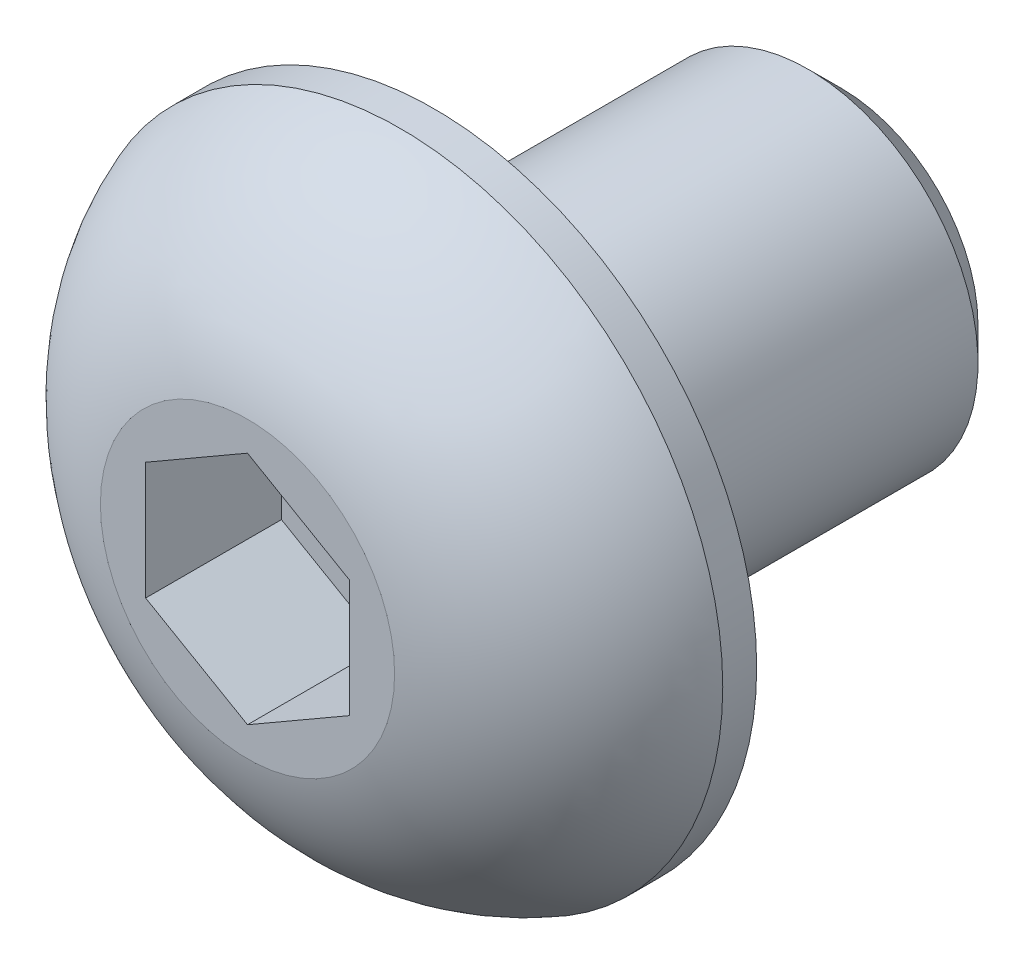
ISO-10303-21;
HEADER;
FILE_DESCRIPTION(('STEP AP214'),'2;1');
FILE_NAME('part.step','',(''),(''),'','','');
FILE_SCHEMA(('AUTOMOTIVE_DESIGN { 1 0 10303 214 1 1 1 1 }'));
ENDSEC;
DATA;
#1=APPLICATION_CONTEXT('core data for automotive mechanical design processes');
#2=APPLICATION_PROTOCOL_DEFINITION('international standard','automotive_design',2000,#1);
#3=PRODUCT_CONTEXT('',#1,'mechanical');
#4=PRODUCT('Part','Part','',(#3));
#5=PRODUCT_RELATED_PRODUCT_CATEGORY('part','',(#4));
#6=PRODUCT_DEFINITION_FORMATION('','',#4);
#7=PRODUCT_DEFINITION_CONTEXT('part definition',#1,'design');
#8=PRODUCT_DEFINITION('design','',#6,#7);
#9=PRODUCT_DEFINITION_SHAPE('','',#8);
#10=(LENGTH_UNIT() NAMED_UNIT(*) SI_UNIT(.MILLI.,.METRE.));
#11=(NAMED_UNIT(*) PLANE_ANGLE_UNIT() SI_UNIT($,.RADIAN.));
#12=(NAMED_UNIT(*) SI_UNIT($,.STERADIAN.) SOLID_ANGLE_UNIT());
#13=UNCERTAINTY_MEASURE_WITH_UNIT(LENGTH_MEASURE(1.E-05),#10,'distance_accuracy_value','');
#14=(GEOMETRIC_REPRESENTATION_CONTEXT(3) GLOBAL_UNCERTAINTY_ASSIGNED_CONTEXT((#13)) GLOBAL_UNIT_ASSIGNED_CONTEXT((#10,
#11,#12)) REPRESENTATION_CONTEXT('',''));
#15=CARTESIAN_POINT('',(0.,0.,0.));
#16=DIRECTION('',(0.,0.,1.));
#17=DIRECTION('',(1.,0.,0.));
#18=AXIS2_PLACEMENT_3D('',#15,#16,#17);
#19=CARTESIAN_POINT('',(0.,0.,0.24999999999209));
#20=DIRECTION('',(0.,0.,0.999999999999998));
#21=DIRECTION('',(-1.,0.,0.));
#22=AXIS2_PLACEMENT_3D('',#19,#20,#21);
#23=CYLINDRICAL_SURFACE('',#22,4.75000000004035);
#24=CARTESIAN_POINT('',(0.,0.,0.499999999985512));
#25=DIRECTION('',(0.,0.,-0.999999999999998));
#26=DIRECTION('',(-1.,0.,0.));
#27=AXIS2_PLACEMENT_3D('',#24,#25,#26);
#28=CIRCLE('',#27,4.75000000008071);
#29=CARTESIAN_POINT('',(-4.75000000008063,0.,0.499999999985401));
#30=VERTEX_POINT('',#29);
#31=EDGE_CURVE('E11',#30,#30,#28,.T.);
#32=ORIENTED_EDGE('',*,*,#31,.T.);
#33=EDGE_LOOP('',(#32));
#34=FACE_BOUND('',#33,.T.);
#35=CARTESIAN_POINT('',(0.,0.,0.));
#36=DIRECTION('',(0.,0.,-0.999999999999998));
#37=DIRECTION('',(-1.,0.,0.));
#38=AXIS2_PLACEMENT_3D('',#35,#36,#37);
#39=CIRCLE('',#38,4.75);
#40=CARTESIAN_POINT('',(-4.75000000000002,0.,0.));
#41=VERTEX_POINT('',#40);
#42=EDGE_CURVE('E125',#41,#41,#39,.T.);
#43=ORIENTED_EDGE('',*,*,#42,.F.);
#44=EDGE_LOOP('',(#43));
#45=FACE_BOUND('',#44,.T.);
#46=ADVANCED_FACE('F16',(#34,#45),#23,.T.);
#47=CARTESIAN_POINT('',(0.,0.,-0.710523895752546));
#48=DIRECTION('',(0.,0.,-0.999999999999998));
#49=DIRECTION('',(0.,-1.,0.));
#50=AXIS2_PLACEMENT_3D('',#47,#48,#49);
#51=DEGENERATE_TOROIDAL_SURFACE('',#50,1.42411293076997,3.53933509291781,.T.);
#52=CARTESIAN_POINT('',(0.,-1.11022302462516E-13,2.75000000000003));
#53=DIRECTION('',(0.,0.,-0.999999999999998));
#54=DIRECTION('',(-1.,0.,0.));
#55=AXIS2_PLACEMENT_3D('',#52,#53,#54);
#56=CIRCLE('',#55,2.166856);
#57=CARTESIAN_POINT('',(-2.16685600000012,0.,2.74999999999936));
#58=VERTEX_POINT('',#57);
#59=EDGE_CURVE('E27',#58,#58,#56,.T.);
#60=ORIENTED_EDGE('',*,*,#59,.T.);
#61=EDGE_LOOP('',(#60));
#62=FACE_BOUND('',#61,.T.);
#63=ORIENTED_EDGE('',*,*,#31,.F.);
#64=EDGE_LOOP('',(#63));
#65=FACE_BOUND('',#64,.T.);
#66=ADVANCED_FACE('F18',(#62,#65),#51,.T.);
#67=CARTESIAN_POINT('',(-1.94342799999969,1.11022302462516E-13,2.75000000000003));
#68=DIRECTION('',(0.,0.,0.999999999999998));
#69=DIRECTION('',(1.,0.,0.));
#70=AXIS2_PLACEMENT_3D('',#67,#68,#69);
#71=PLANE('',#70);
#72=ORIENTED_EDGE('',*,*,#59,.F.);
#73=EDGE_LOOP('',(#72));
#74=FACE_BOUND('',#73,.T.);
#75=DIRECTION('',(0.,-1.,0.));
#76=VECTOR('',#75,1.);
#77=CARTESIAN_POINT('',(1.50000000000003,0.216506350949941,2.74999999999936));
#78=LINE('',#77,#76);
#79=CARTESIAN_POINT('',(1.50000000000028,0.866025403799875,2.74999999999992));
#80=VERTEX_POINT('',#79);
#81=CARTESIAN_POINT('',(1.49999999999995,-0.866025403799986,2.75000000000014));
#82=VERTEX_POINT('',#81);
#83=EDGE_CURVE('E109',#80,#82,#78,.T.);
#84=ORIENTED_EDGE('',*,*,#83,.T.);
#85=DIRECTION('',(-0.866025403780548,-0.500000000006738,0.));
#86=VECTOR('',#85,1.);
#87=CARTESIAN_POINT('',(0.0212145000165753,-1.71980261030458,2.74999999999914));
#88=LINE('',#87,#86);
#89=CARTESIAN_POINT('',(1.11022302462516E-13,-1.73205080760008,2.7499999999987));
#90=VERTEX_POINT('',#89);
#91=EDGE_CURVE('E159',#82,#90,#88,.T.);
#92=ORIENTED_EDGE('',*,*,#91,.T.);
#93=DIRECTION('',(-0.866025403780548,0.500000000006738,0.));
#94=VECTOR('',#93,1.);
#95=CARTESIAN_POINT('',(-1.47878550000347,-0.87827360108389,2.74999999999948));
#96=LINE('',#95,#94);
#97=CARTESIAN_POINT('',(-1.49999999999996,-0.866025403799986,2.75000000000014));
#98=VERTEX_POINT('',#97);
#99=EDGE_CURVE('E20',#90,#98,#96,.T.);
#100=ORIENTED_EDGE('',*,*,#99,.T.);
#101=DIRECTION('',(0.,1.,0.));
#102=VECTOR('',#101,1.);
#103=CARTESIAN_POINT('',(-1.49999999999995,0.,2.74999999999948));
#104=LINE('',#103,#102);
#105=CARTESIAN_POINT('',(-1.49999999999996,0.866025403800097,2.74999999999992));
#106=VERTEX_POINT('',#105);
#107=EDGE_CURVE('E136',#98,#106,#104,.T.);
#108=ORIENTED_EDGE('',*,*,#107,.T.);
#109=DIRECTION('',(0.866025403780548,0.500000000006738,0.));
#110=VECTOR('',#109,1.);
#111=CARTESIAN_POINT('',(-1.47878550000324,0.878273601084001,2.75000000000003));
#112=LINE('',#111,#110);
#113=CARTESIAN_POINT('',(-1.11022302462516E-13,1.73205080759986,2.74999999999948));
#114=VERTEX_POINT('',#113);
#115=EDGE_CURVE('E50',#106,#114,#112,.T.);
#116=ORIENTED_EDGE('',*,*,#115,.T.);
#117=DIRECTION('',(0.866025403780548,-0.500000000006738,0.));
#118=VECTOR('',#117,1.);
#119=CARTESIAN_POINT('',(0.0212145000166863,1.71980261030447,2.74999999999948));
#120=LINE('',#119,#118);
#121=EDGE_CURVE('E101',#114,#80,#120,.T.);
#122=ORIENTED_EDGE('',*,*,#121,.T.);
#123=EDGE_LOOP('',(#84,#92,#100,#108,#116,#122));
#124=FACE_BOUND('',#123,.T.);
#125=ADVANCED_FACE('F206',(#74,#124),#71,.T.);
#126=CARTESIAN_POINT('',(-1.00462500000001,-1.66533453693773E-13,-6.00000000000056));
#127=DIRECTION('',(0.,0.,-0.999999999999998));
#128=DIRECTION('',(-1.,0.,0.));
#129=AXIS2_PLACEMENT_3D('',#126,#127,#128);
#130=PLANE('',#129);
#131=CARTESIAN_POINT('',(0.,-1.66533453693773E-13,-6.00000000000001));
#132=DIRECTION('',(0.,0.,-0.999999999999998));
#133=DIRECTION('',(-1.,0.,0.));
#134=AXIS2_PLACEMENT_3D('',#131,#132,#133);
#135=CIRCLE('',#134,2.00925);
#136=CARTESIAN_POINT('',(-2.00924999999996,0.,-6.00000000000067));
#137=VERTEX_POINT('',#136);
#138=EDGE_CURVE('E128',#137,#137,#135,.T.);
#139=ORIENTED_EDGE('',*,*,#138,.T.);
#140=EDGE_LOOP('',(#139));
#141=FACE_BOUND('',#140,.T.);
#142=ADVANCED_FACE('F215',(#141),#130,.T.);
#143=CARTESIAN_POINT('',(0.,0.,-5.75462500000057));
#144=DIRECTION('',(0.,0.,0.999999999999998));
#145=DIRECTION('',(-1.,0.,0.));
#146=AXIS2_PLACEMENT_3D('',#143,#144,#145);
#147=CONICAL_SURFACE('',#146,2.254625,0.785398163397448);
#148=CARTESIAN_POINT('',(0.,0.,-5.50925000000002));
#149=DIRECTION('',(0.,0.,-0.999999999999998));
#150=DIRECTION('',(-1.,0.,0.));
#151=AXIS2_PLACEMENT_3D('',#148,#149,#150);
#152=CIRCLE('',#151,2.5);
#153=CARTESIAN_POINT('',(-2.49999999999993,1.11022302462516E-13,-5.50925000000069));
#154=VERTEX_POINT('',#153);
#155=EDGE_CURVE('E124',#154,#154,#152,.T.);
#156=ORIENTED_EDGE('',*,*,#155,.T.);
#157=EDGE_LOOP('',(#156));
#158=FACE_BOUND('',#157,.T.);
#159=ORIENTED_EDGE('',*,*,#138,.F.);
#160=EDGE_LOOP('',(#159));
#161=FACE_BOUND('',#160,.T.);
#162=ADVANCED_FACE('F213',(#158,#161),#147,.T.);
#163=CARTESIAN_POINT('',(0.,0.,-2.85462500000011));
#164=DIRECTION('',(0.,0.,0.999999999999998));
#165=DIRECTION('',(-1.,0.,0.));
#166=AXIS2_PLACEMENT_3D('',#163,#164,#165);
#167=CYLINDRICAL_SURFACE('',#166,2.5);
#168=CARTESIAN_POINT('',(0.,0.,-0.200000000000644));
#169=DIRECTION('',(0.,0.,-0.999999999999998));
#170=DIRECTION('',(-1.,0.,0.));
#171=AXIS2_PLACEMENT_3D('',#168,#169,#170);
#172=CIRCLE('',#171,2.5);
#173=CARTESIAN_POINT('',(-2.49999999999995,1.11022302462516E-13,-0.2000000000002));
#174=VERTEX_POINT('',#173);
#175=EDGE_CURVE('E122',#174,#174,#172,.T.);
#176=ORIENTED_EDGE('',*,*,#175,.T.);
#177=EDGE_LOOP('',(#176));
#178=FACE_BOUND('',#177,.T.);
#179=ORIENTED_EDGE('',*,*,#155,.F.);
#180=EDGE_LOOP('',(#179));
#181=FACE_BOUND('',#180,.T.);
#182=ADVANCED_FACE('F197',(#178,#181),#167,.T.);
#183=CARTESIAN_POINT('',(0.,0.,-0.200000000000644));
#184=DIRECTION('',(0.,0.,-0.999999999999998));
#185=DIRECTION('',(0.,-1.,0.));
#186=AXIS2_PLACEMENT_3D('',#183,#184,#185);
#187=TOROIDAL_SURFACE('',#186,2.7,0.2);
#188=CARTESIAN_POINT('',(0.,0.,0.));
#189=DIRECTION('',(0.,0.,-0.999999999999998));
#190=DIRECTION('',(-1.,0.,0.));
#191=AXIS2_PLACEMENT_3D('',#188,#189,#190);
#192=CIRCLE('',#191,2.7);
#193=CARTESIAN_POINT('',(-2.69999999999994,-1.11022302462516E-13,-6.66133814775094E-13));
#194=VERTEX_POINT('',#193);
#195=EDGE_CURVE('E165',#194,#194,#192,.T.);
#196=ORIENTED_EDGE('',*,*,#195,.T.);
#197=EDGE_LOOP('',(#196));
#198=FACE_BOUND('',#197,.T.);
#199=ORIENTED_EDGE('',*,*,#175,.F.);
#200=EDGE_LOOP('',(#199));
#201=FACE_BOUND('',#200,.T.);
#202=ADVANCED_FACE('F182',(#198,#201),#187,.F.);
#203=CARTESIAN_POINT('',(-3.72499999999996,0.,0.));
#204=DIRECTION('',(0.,0.,-0.999999999999998));
#205=DIRECTION('',(-1.,0.,0.));
#206=AXIS2_PLACEMENT_3D('',#203,#204,#205);
#207=PLANE('',#206);
#208=ORIENTED_EDGE('',*,*,#42,.T.);
#209=EDGE_LOOP('',(#208));
#210=FACE_BOUND('',#209,.T.);
#211=ORIENTED_EDGE('',*,*,#195,.F.);
#212=EDGE_LOOP('',(#211));
#213=FACE_BOUND('',#212,.T.);
#214=ADVANCED_FACE('F186',(#210,#213),#207,.T.);
#215=CARTESIAN_POINT('',(3.33066907387547E-13,-1.11022302462516E-13,0.749999999999806));
#216=DIRECTION('',(0.,0.,-0.999999999999998));
#217=DIRECTION('',(1.,0.,0.));
#218=AXIS2_PLACEMENT_3D('',#215,#216,#217);
#219=PLANE('',#218);
#220=DIRECTION('',(0.,1.,0.));
#221=VECTOR('',#220,1.);
#222=CARTESIAN_POINT('',(1.50000000000029,0.,0.750000000000028));
#223=LINE('',#222,#221);
#224=CARTESIAN_POINT('',(1.50000000000008,-0.866025403799986,0.749999999999362));
#225=VERTEX_POINT('',#224);
#226=CARTESIAN_POINT('',(1.50000000000006,0.866025403800041,0.750000000000028));
#227=VERTEX_POINT('',#226);
#228=EDGE_CURVE('E107',#225,#227,#223,.T.);
#229=ORIENTED_EDGE('',*,*,#228,.T.);
#230=DIRECTION('',(-0.866025403780548,0.500000000006738,0.));
#231=VECTOR('',#230,1.);
#232=CARTESIAN_POINT('',(3.19189119579733E-13,1.73205080760003,0.750000000000028));
#233=LINE('',#232,#231);
#234=CARTESIAN_POINT('',(3.19189119579733E-13,1.73205080760003,0.750000000000028));
#235=VERTEX_POINT('',#234);
#236=EDGE_CURVE('E93',#227,#235,#233,.T.);
#237=ORIENTED_EDGE('',*,*,#236,.T.);
#238=DIRECTION('',(-0.866025403780548,-0.500000000006738,0.));
#239=VECTOR('',#238,1.);
#240=CARTESIAN_POINT('',(-1.50000000000017,0.866025403799986,0.749999999999251));
#241=LINE('',#240,#239);
#242=CARTESIAN_POINT('',(-1.50000000000017,0.866025403799986,0.749999999999251));
#243=VERTEX_POINT('',#242);
#244=EDGE_CURVE('E60',#235,#243,#241,.T.);
#245=ORIENTED_EDGE('',*,*,#244,.T.);
#246=DIRECTION('',(0.,-1.,0.));
#247=VECTOR('',#246,1.);
#248=CARTESIAN_POINT('',(-1.50000000000006,-0.866025403799986,0.750000000000028));
#249=LINE('',#248,#247);
#250=CARTESIAN_POINT('',(-1.50000000000006,-0.866025403799986,0.750000000000028));
#251=VERTEX_POINT('',#250);
#252=EDGE_CURVE('E133',#243,#251,#249,.T.);
#253=ORIENTED_EDGE('',*,*,#252,.T.);
#254=DIRECTION('',(0.866025403780548,-0.500000000006738,0.));
#255=VECTOR('',#254,1.);
#256=CARTESIAN_POINT('',(0.,-1.73205080760003,0.75000000000025));
#257=LINE('',#256,#255);
#258=CARTESIAN_POINT('',(0.,-1.73205080760003,0.75000000000025));
#259=VERTEX_POINT('',#258);
#260=EDGE_CURVE('E151',#251,#259,#257,.T.);
#261=ORIENTED_EDGE('',*,*,#260,.T.);
#262=DIRECTION('',(0.866025403780548,0.500000000006738,0.));
#263=VECTOR('',#262,1.);
#264=CARTESIAN_POINT('',(1.50000000000008,-0.866025403799986,0.749999999999362));
#265=LINE('',#264,#263);
#266=EDGE_CURVE('E87',#259,#225,#265,.T.);
#267=ORIENTED_EDGE('',*,*,#266,.T.);
#268=EDGE_LOOP('',(#229,#237,#245,#253,#261,#267));
#269=FACE_BOUND('',#268,.T.);
#270=ADVANCED_FACE('F112',(#269),#219,.F.);
#271=CARTESIAN_POINT('',(0.750000000000028,-1.29903810570009,2.75000000000059));
#272=DIRECTION('',(0.500000000006738,-0.866025403780548,0.));
#273=DIRECTION('',(-0.866025403780548,-0.500000000006738,0.));
#274=AXIS2_PLACEMENT_3D('',#271,#272,#273);
#275=PLANE('',#274);
#276=ORIENTED_EDGE('',*,*,#266,.F.);
#277=DIRECTION('',(0.,0.,-0.999999999999998));
#278=VECTOR('',#277,1.);
#279=CARTESIAN_POINT('',(1.11022302462516E-13,-1.73205080760008,2.7499999999987));
#280=LINE('',#279,#278);
#281=EDGE_CURVE('E154',#90,#259,#280,.T.);
#282=ORIENTED_EDGE('',*,*,#281,.F.);
#283=ORIENTED_EDGE('',*,*,#91,.F.);
#284=DIRECTION('',(0.,0.,-0.999999999999998));
#285=VECTOR('',#284,1.);
#286=CARTESIAN_POINT('',(1.49999999999995,-0.866025403799986,2.75000000000014));
#287=LINE('',#286,#285);
#288=EDGE_CURVE('E114',#82,#225,#287,.T.);
#289=ORIENTED_EDGE('',*,*,#288,.T.);
#290=EDGE_LOOP('',(#276,#282,#283,#289));
#291=FACE_BOUND('',#290,.T.);
#292=ADVANCED_FACE('F195',(#291),#275,.F.);
#293=CARTESIAN_POINT('',(-0.750000000000042,-1.29903810570003,2.74999999999936));
#294=DIRECTION('',(-0.500000000006738,-0.866025403780548,0.));
#295=DIRECTION('',(-0.866025403780548,0.500000000006738,0.));
#296=AXIS2_PLACEMENT_3D('',#293,#294,#295);
#297=PLANE('',#296);
#298=ORIENTED_EDGE('',*,*,#260,.F.);
#299=DIRECTION('',(0.,0.,-0.999999999999998));
#300=VECTOR('',#299,1.);
#301=CARTESIAN_POINT('',(-1.49999999999996,-0.866025403799986,2.75000000000014));
#302=LINE('',#301,#300);
#303=EDGE_CURVE('E141',#98,#251,#302,.T.);
#304=ORIENTED_EDGE('',*,*,#303,.F.);
#305=ORIENTED_EDGE('',*,*,#99,.F.);
#306=ORIENTED_EDGE('',*,*,#281,.T.);
#307=EDGE_LOOP('',(#298,#304,#305,#306));
#308=FACE_BOUND('',#307,.T.);
#309=ADVANCED_FACE('F263',(#308),#297,.F.);
#310=CARTESIAN_POINT('',(-1.49999999999995,0.,2.74999999999948));
#311=DIRECTION('',(-1.,0.,0.));
#312=DIRECTION('',(0.,1.,0.));
#313=AXIS2_PLACEMENT_3D('',#310,#311,#312);
#314=PLANE('',#313);
#315=ORIENTED_EDGE('',*,*,#252,.F.);
#316=DIRECTION('',(0.,0.,-0.999999999999998));
#317=VECTOR('',#316,1.);
#318=CARTESIAN_POINT('',(-1.49999999999996,0.866025403800097,2.74999999999992));
#319=LINE('',#318,#317);
#320=EDGE_CURVE('E137',#106,#243,#319,.T.);
#321=ORIENTED_EDGE('',*,*,#320,.F.);
#322=ORIENTED_EDGE('',*,*,#107,.F.);
#323=ORIENTED_EDGE('',*,*,#303,.T.);
#324=EDGE_LOOP('',(#315,#321,#322,#323));
#325=FACE_BOUND('',#324,.T.);
#326=ADVANCED_FACE('F223',(#325),#314,.F.);
#327=CARTESIAN_POINT('',(-0.749999999999806,1.29903810569998,2.74999999999936));
#328=DIRECTION('',(-0.500000000006738,0.866025403780548,0.));
#329=DIRECTION('',(0.866025403780548,0.500000000006738,0.));
#330=AXIS2_PLACEMENT_3D('',#327,#328,#329);
#331=PLANE('',#330);
#332=ORIENTED_EDGE('',*,*,#244,.F.);
#333=DIRECTION('',(0.,0.,-0.999999999999998));
#334=VECTOR('',#333,1.);
#335=CARTESIAN_POINT('',(-1.11022302462516E-13,1.73205080759986,2.74999999999948));
#336=LINE('',#335,#334);
#337=EDGE_CURVE('E99',#114,#235,#336,.T.);
#338=ORIENTED_EDGE('',*,*,#337,.F.);
#339=ORIENTED_EDGE('',*,*,#115,.F.);
#340=ORIENTED_EDGE('',*,*,#320,.T.);
#341=EDGE_LOOP('',(#332,#338,#339,#340));
#342=FACE_BOUND('',#341,.T.);
#343=ADVANCED_FACE('F221',(#342),#331,.F.);
#344=CARTESIAN_POINT('',(0.750000000000042,1.29903810569998,2.74999999999959));
#345=DIRECTION('',(0.500000000006738,0.866025403780548,0.));
#346=DIRECTION('',(0.866025403780548,-0.500000000006738,0.));
#347=AXIS2_PLACEMENT_3D('',#344,#345,#346);
#348=PLANE('',#347);
#349=ORIENTED_EDGE('',*,*,#236,.F.);
#350=DIRECTION('',(0.,0.,-0.999999999999998));
#351=VECTOR('',#350,1.);
#352=CARTESIAN_POINT('',(1.50000000000028,0.866025403799875,2.74999999999992));
#353=LINE('',#352,#351);
#354=EDGE_CURVE('E97',#80,#227,#353,.T.);
#355=ORIENTED_EDGE('',*,*,#354,.F.);
#356=ORIENTED_EDGE('',*,*,#121,.F.);
#357=ORIENTED_EDGE('',*,*,#337,.T.);
#358=EDGE_LOOP('',(#349,#355,#356,#357));
#359=FACE_BOUND('',#358,.T.);
#360=ADVANCED_FACE('F95',(#359),#348,.F.);
#361=CARTESIAN_POINT('',(1.50000000000029,0.433012701899993,2.75000000000003));
#362=DIRECTION('',(1.,0.,0.));
#363=DIRECTION('',(0.,-1.,0.));
#364=AXIS2_PLACEMENT_3D('',#361,#362,#363);
#365=PLANE('',#364);
#366=ORIENTED_EDGE('',*,*,#228,.F.);
#367=ORIENTED_EDGE('',*,*,#288,.F.);
#368=ORIENTED_EDGE('',*,*,#83,.F.);
#369=ORIENTED_EDGE('',*,*,#354,.T.);
#370=EDGE_LOOP('',(#366,#367,#368,#369));
#371=FACE_BOUND('',#370,.T.);
#372=ADVANCED_FACE('F105',(#371),#365,.F.);
#373=CLOSED_SHELL('',(#46,#66,#125,#142,#162,#182,#202,#214,#270,#292,#309,#326,#343,#360,#372));
#374=MANIFOLD_SOLID_BREP('B1',#373);
#375=ADVANCED_BREP_SHAPE_REPRESENTATION('',(#18,#374),#14);
#376=SHAPE_DEFINITION_REPRESENTATION(#9,#375);
ENDSEC;
END-ISO-10303-21;
